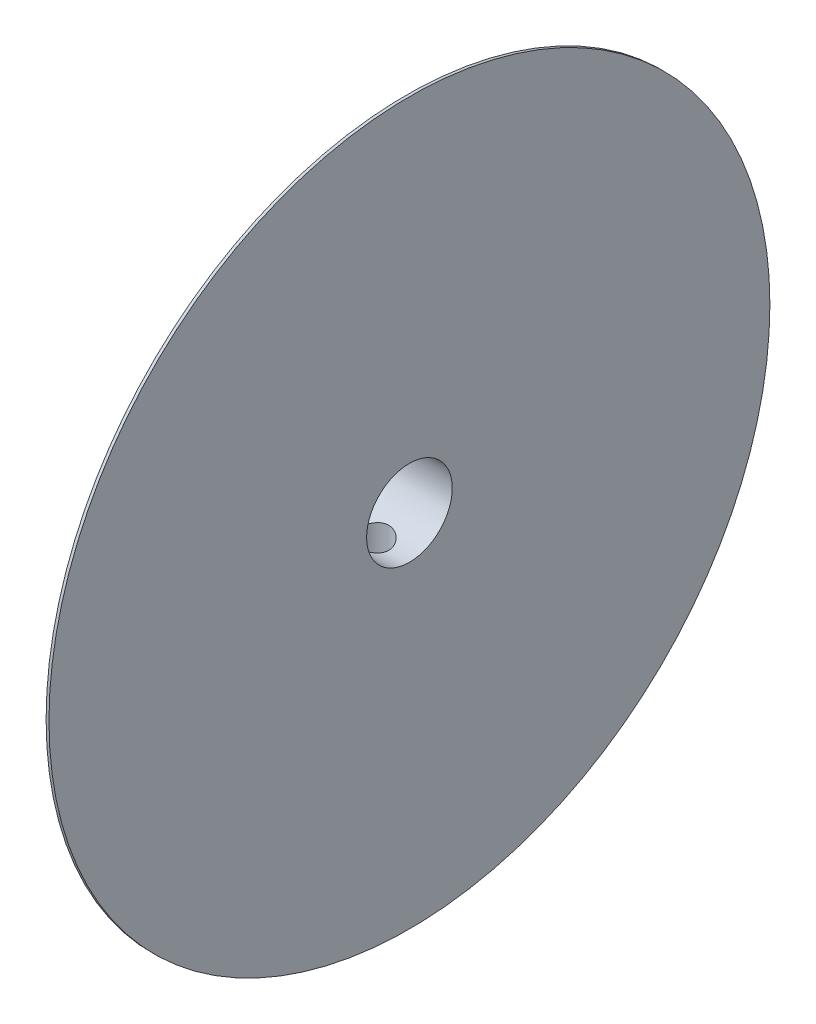
ISO-10303-21;
HEADER;
FILE_DESCRIPTION(('STEP AP214'),'2;1');
FILE_NAME('part.step','',(''),(''),'','','');
FILE_SCHEMA(('AUTOMOTIVE_DESIGN { 1 0 10303 214 1 1 1 1 }'));
ENDSEC;
DATA;
#1=APPLICATION_CONTEXT('core data for automotive mechanical design processes');
#2=APPLICATION_PROTOCOL_DEFINITION('international standard','automotive_design',2000,#1);
#3=PRODUCT_CONTEXT('',#1,'mechanical');
#4=PRODUCT('Part','Part','',(#3));
#5=PRODUCT_RELATED_PRODUCT_CATEGORY('part','',(#4));
#6=PRODUCT_DEFINITION_FORMATION('','',#4);
#7=PRODUCT_DEFINITION_CONTEXT('part definition',#1,'design');
#8=PRODUCT_DEFINITION('design','',#6,#7);
#9=PRODUCT_DEFINITION_SHAPE('','',#8);
#10=(LENGTH_UNIT() NAMED_UNIT(*) SI_UNIT(.MILLI.,.METRE.));
#11=(NAMED_UNIT(*) PLANE_ANGLE_UNIT() SI_UNIT($,.RADIAN.));
#12=(NAMED_UNIT(*) SI_UNIT($,.STERADIAN.) SOLID_ANGLE_UNIT());
#13=UNCERTAINTY_MEASURE_WITH_UNIT(LENGTH_MEASURE(1.E-05),#10,'distance_accuracy_value','');
#14=(GEOMETRIC_REPRESENTATION_CONTEXT(3) GLOBAL_UNCERTAINTY_ASSIGNED_CONTEXT((#13)) GLOBAL_UNIT_ASSIGNED_CONTEXT((#10,
#11,#12)) REPRESENTATION_CONTEXT('',''));
#15=CARTESIAN_POINT('',(0.,0.,0.));
#16=DIRECTION('',(0.,0.,1.));
#17=DIRECTION('',(1.,0.,0.));
#18=AXIS2_PLACEMENT_3D('',#15,#16,#17);
#19=CARTESIAN_POINT('',(-5.,0.,0.));
#20=DIRECTION('',(1.,0.,0.));
#21=DIRECTION('',(0.,0.,-1.));
#22=AXIS2_PLACEMENT_3D('',#19,#20,#21);
#23=CYLINDRICAL_SURFACE('',#22,7.25);
#24=CARTESIAN_POINT('',(-2.5,-7.14142842854285,1.25));
#25=CARTESIAN_POINT('',(-2.56965087488858,-7.14142971421709,1.24999723218608));
#26=CARTESIAN_POINT('',(-2.6393388962842,-7.14245844346318,1.24415878187445));
#27=CARTESIAN_POINT('',(-2.77675705222951,-7.14645809578312,1.22097086458515));
#28=CARTESIAN_POINT('',(-2.84448536188926,-7.14943077190657,1.20361100740192));
#29=CARTESIAN_POINT('',(-2.97597557878876,-7.15697185613425,1.15792320798728));
#30=CARTESIAN_POINT('',(-3.03974084640805,-7.16153888997427,1.12960470933528));
#31=CARTESIAN_POINT('',(-3.16160895574196,-7.17175247485429,1.06282742249073));
#32=CARTESIAN_POINT('',(-3.21971238180596,-7.17739891431205,1.02436968227406));
#33=CARTESIAN_POINT('',(-3.32922613195372,-7.18920159394736,0.937973280437725));
#34=CARTESIAN_POINT('',(-3.38056811585885,-7.19536214240758,0.889948569077897));
#35=CARTESIAN_POINT('',(-3.4745074937364,-7.20746068922563,0.785967443951569));
#36=CARTESIAN_POINT('',(-3.51710435507917,-7.21339867401004,0.730010547418791));
#37=CARTESIAN_POINT('',(-3.5926022771987,-7.2244287925949,0.611308996292318));
#38=CARTESIAN_POINT('',(-3.62543950854127,-7.22951526688981,0.548523173341608));
#39=CARTESIAN_POINT('',(-3.68007551886598,-7.23822123690654,0.418224186896049));
#40=CARTESIAN_POINT('',(-3.70187506550793,-7.24184083464466,0.350711352531921));
#41=CARTESIAN_POINT('',(-3.7336072496867,-7.24717480217743,0.213581461092618));
#42=CARTESIAN_POINT('',(-3.74365482340877,-7.2489076132889,0.143991729585504));
#43=CARTESIAN_POINT('',(-3.75195544180747,-7.2503361806486,0.00409407070862154));
#44=CARTESIAN_POINT('',(-3.75020934185093,-7.25003208462881,-0.0662138042066329));
#45=CARTESIAN_POINT('',(-3.73506141942176,-7.24743564978377,-0.20476549232864));
#46=CARTESIAN_POINT('',(-3.72178330700746,-7.24516441422403,-0.273023282991308));
#47=CARTESIAN_POINT('',(-3.68414330263072,-7.2389124583865,-0.406327251761107));
#48=CARTESIAN_POINT('',(-3.65978105482079,-7.2349316832255,-0.471373326684291));
#49=CARTESIAN_POINT('',(-3.60054273903589,-7.2256721655453,-0.596772947723074));
#50=CARTESIAN_POINT('',(-3.56561610006645,-7.22038720289371,-0.657102126264377));
#51=CARTESIAN_POINT('',(-3.48627754483205,-7.20910577268085,-0.771089902203244));
#52=CARTESIAN_POINT('',(-3.44186480845498,-7.20310924362167,-0.824747922216766));
#53=CARTESIAN_POINT('',(-3.34412978072987,-7.19097900207124,-0.924601707526047));
#54=CARTESIAN_POINT('',(-3.29069933330247,-7.18484451921934,-0.970691580728869));
#55=CARTESIAN_POINT('',(-3.17680889463413,-7.17320480520099,-1.05326978277058));
#56=CARTESIAN_POINT('',(-3.11634882942283,-7.16769958065723,-1.08975801056134));
#57=CARTESIAN_POINT('',(-2.98998795274555,-7.1579411060102,-1.15212042743271));
#58=CARTESIAN_POINT('',(-2.92408037544799,-7.15368944368538,-1.17798117178192));
#59=CARTESIAN_POINT('',(-2.78876672867699,-7.14694519270228,-1.21823438745853));
#60=CARTESIAN_POINT('',(-2.71936099097346,-7.14445243756213,-1.2326279441803));
#61=CARTESIAN_POINT('',(-2.57997061303613,-7.14154065319019,-1.24938764754429));
#62=CARTESIAN_POINT('',(-2.5100046876036,-7.14109554554239,-1.25190505695099));
#63=CARTESIAN_POINT('',(-2.3706515010969,-7.14225990611827,-1.24524472925199));
#64=CARTESIAN_POINT('',(-2.30126421615114,-7.14386928915848,-1.23606747703139));
#65=CARTESIAN_POINT('',(-2.16552287959039,-7.14893714768664,-1.20640754124708));
#66=CARTESIAN_POINT('',(-2.09915135559055,-7.15238292575729,-1.18600245936773));
#67=CARTESIAN_POINT('',(-1.97076970598821,-7.16072459277848,-1.13454772720554));
#68=CARTESIAN_POINT('',(-1.90875985793114,-7.16562057390631,-1.10349740027362));
#69=CARTESIAN_POINT('',(-1.79019038710856,-7.17637126932986,-1.03127893427043));
#70=CARTESIAN_POINT('',(-1.73369041009044,-7.18223494497608,-0.990014226162167));
#71=CARTESIAN_POINT('',(-1.62836244505018,-7.19423440082679,-0.898670276540918));
#72=CARTESIAN_POINT('',(-1.5795350365973,-7.20037020154216,-0.848590369752094));
#73=CARTESIAN_POINT('',(-1.49038251598762,-7.21230539665784,-0.740365997921969));
#74=CARTESIAN_POINT('',(-1.45015850860188,-7.21810026577049,-0.682137669786819));
#75=CARTESIAN_POINT('',(-1.38006419912053,-7.22862716641665,-0.559662033046176));
#76=CARTESIAN_POINT('',(-1.35019354430749,-7.23335923415568,-0.495414929582723));
#77=CARTESIAN_POINT('',(-1.30180961885663,-7.24120774262404,-0.363020254393968));
#78=CARTESIAN_POINT('',(-1.28324430675976,-7.24433157603979,-0.294892158495961));
#79=CARTESIAN_POINT('',(-1.25783085755296,-7.24864297538833,-0.156426634167659));
#80=CARTESIAN_POINT('',(-1.25098168566781,-7.24983071231766,-0.0860894014082541));
#81=CARTESIAN_POINT('',(-1.24922637569705,-7.25013341590993,0.0538236190178097));
#82=CARTESIAN_POINT('',(-1.25416670972454,-7.24927502822976,0.12339747038685));
#83=CARTESIAN_POINT('',(-1.27551699475709,-7.24563658240393,0.260708504701283));
#84=CARTESIAN_POINT('',(-1.29192687025291,-7.24285653690943,0.328445699735172));
#85=CARTESIAN_POINT('',(-1.33568993685657,-7.23568627667127,0.460095987386091));
#86=CARTESIAN_POINT('',(-1.36302919576524,-7.23129811246316,0.524013829926682));
#87=CARTESIAN_POINT('',(-1.42785755243027,-7.2213895739629,0.64637868576379));
#88=CARTESIAN_POINT('',(-1.46534718535402,-7.21586913997677,0.704825410382866));
#89=CARTESIAN_POINT('',(-1.54995222729674,-7.20422227015533,0.8153602012511));
#90=CARTESIAN_POINT('',(-1.59717968019279,-7.19808925251501,0.867361823384343));
#91=CARTESIAN_POINT('',(-1.6996851896951,-7.18595292186522,0.962755858263156));
#92=CARTESIAN_POINT('',(-1.75496512997298,-7.17994963958234,1.00614625100788));
#93=CARTESIAN_POINT('',(-1.87250865555793,-7.1687028430237,1.08339247637685));
#94=CARTESIAN_POINT('',(-1.9348223249925,-7.16346547764741,1.11717300578367));
#95=CARTESIAN_POINT('',(-2.06430619208286,-7.15441647935852,1.17373430129081));
#96=CARTESIAN_POINT('',(-2.13147153294016,-7.15060344358231,1.19652589718002));
#97=CARTESIAN_POINT('',(-2.2490687245248,-7.14566721735659,1.22559588019671));
#98=CARTESIAN_POINT('',(-2.29879437345873,-7.1440866662801,1.23473248261273));
#99=CARTESIAN_POINT('',(-2.39900684777768,-7.14196681631464,1.24693548432377));
#100=CARTESIAN_POINT('',(-2.44949365766507,-7.14142749625445,1.25000200704094));
#101=CARTESIAN_POINT('',(-2.5,-7.14142842854285,1.25));
#102=B_SPLINE_CURVE_WITH_KNOTS('',3,(#24,#25,#26,#27,#28,#29,#30,#31,#32,#33,#34,#35,#36,#37,
#38,#39,#40,#41,#42,#43,#44,#45,#46,#47,#48,#49,#50,#51,#52,#53,#54,#55,#56,#57,#58,#59,#60,#61,
#62,#63,#64,#65,#66,#67,#68,#69,#70,#71,#72,#73,#74,#75,#76,#77,#78,#79,#80,#81,#82,#83,#84,#85,
#86,#87,#88,#89,#90,#91,#92,#93,#94,#95,#96,#97,#98,#99,#100,#101),.UNSPECIFIED.,.T.,.F.,(4,2,2,
2,2,2,2,2,2,2,2,2,2,2,2,2,2,2,2,2,2,2,2,2,2,2,2,2,2,2,2,2,2,2,2,2,2,2,4),(0.,0.208767897361638,
0.417724321542029,0.626501077645268,0.835256263368652,1.04598154842973,1.25671966410077,
1.46880715279201,1.68087988898579,1.89086070156808,2.10082628490985,2.30856689374179,
2.51631417239412,2.72507209850941,2.93384807991603,3.14533377792209,3.35682170152396,
3.56857635896328,3.78031097097978,3.9893413699604,4.19836310238601,4.4059579939034,
4.61356608332654,4.82321739082735,5.03288452733008,5.24489456323004,5.45689737567405,
5.66791675720179,5.87891750043241,6.08718552897792,6.29545218641291,6.50345419881241,
6.71146718002738,6.92202244194999,7.13262703717487,7.34483913347008,7.55684166131537,
7.70822981412779,7.85961488875257),.UNSPECIFIED.);
#103=CARTESIAN_POINT('',(-2.5,-7.14142842854285,1.25));
#104=VERTEX_POINT('',#103);
#105=EDGE_CURVE('E56',#104,#104,#102,.T.);
#106=ORIENTED_EDGE('',*,*,#105,.F.);
#107=EDGE_LOOP('',(#106));
#108=FACE_BOUND('',#107,.T.);
#109=CARTESIAN_POINT('',(-5.,0.,0.));
#110=DIRECTION('',(-1.,0.,0.));
#111=DIRECTION('',(0.,0.,1.));
#112=AXIS2_PLACEMENT_3D('',#109,#110,#111);
#113=CIRCLE('',#112,7.25);
#114=CARTESIAN_POINT('',(-5.,0.,7.25));
#115=VERTEX_POINT('',#114);
#116=EDGE_CURVE('E46',#115,#115,#113,.T.);
#117=ORIENTED_EDGE('',*,*,#116,.F.);
#118=EDGE_LOOP('',(#117));
#119=FACE_BOUND('',#118,.T.);
#120=CARTESIAN_POINT('',(0.,0.,0.));
#121=DIRECTION('',(-1.,0.,0.));
#122=DIRECTION('',(0.,0.,1.));
#123=AXIS2_PLACEMENT_3D('',#120,#121,#122);
#124=CIRCLE('',#123,7.25);
#125=CARTESIAN_POINT('',(0.,0.,7.25));
#126=VERTEX_POINT('',#125);
#127=EDGE_CURVE('E10',#126,#126,#124,.T.);
#128=ORIENTED_EDGE('',*,*,#127,.T.);
#129=EDGE_LOOP('',(#128));
#130=FACE_BOUND('',#129,.T.);
#131=CARTESIAN_POINT('',(-2.5,7.14142842854285,-1.25));
#132=CARTESIAN_POINT('',(-2.43034912511142,7.14142971421709,-1.24999723218608));
#133=CARTESIAN_POINT('',(-2.3606611037158,7.14245844346318,-1.24415878187445));
#134=CARTESIAN_POINT('',(-2.22324294777049,7.14645809578312,-1.22097086458515));
#135=CARTESIAN_POINT('',(-2.15551463811074,7.14943077190657,-1.20361100740192));
#136=CARTESIAN_POINT('',(-2.02402442121124,7.15697185613425,-1.15792320798728));
#137=CARTESIAN_POINT('',(-1.96025915359195,7.16153888997427,-1.12960470933528));
#138=CARTESIAN_POINT('',(-1.83839104425804,7.17175247485429,-1.06282742249073));
#139=CARTESIAN_POINT('',(-1.78028761819404,7.17739891431205,-1.02436968227406));
#140=CARTESIAN_POINT('',(-1.67077386804628,7.18920159394736,-0.937973280437725));
#141=CARTESIAN_POINT('',(-1.61943188414115,7.19536214240758,-0.889948569077896));
#142=CARTESIAN_POINT('',(-1.5254925062636,7.20746068922563,-0.785967443951568));
#143=CARTESIAN_POINT('',(-1.48289564492083,7.21339867401004,-0.730010547418791));
#144=CARTESIAN_POINT('',(-1.4073977228013,7.2244287925949,-0.611308996292318));
#145=CARTESIAN_POINT('',(-1.37456049145873,7.22951526688981,-0.548523173341608));
#146=CARTESIAN_POINT('',(-1.31992448113402,7.23822123690654,-0.41822418689605));
#147=CARTESIAN_POINT('',(-1.29812493449207,7.24184083464466,-0.350711352531921));
#148=CARTESIAN_POINT('',(-1.2663927503133,7.24717480217743,-0.213581461092618));
#149=CARTESIAN_POINT('',(-1.25634517659123,7.2489076132889,-0.143991729585504));
#150=CARTESIAN_POINT('',(-1.24804455819253,7.2503361806486,-0.00409407070862197));
#151=CARTESIAN_POINT('',(-1.24979065814907,7.25003208462881,0.0662138042066324));
#152=CARTESIAN_POINT('',(-1.26493858057824,7.24743564978377,0.20476549232864));
#153=CARTESIAN_POINT('',(-1.27821669299254,7.24516441422403,0.273023282991308));
#154=CARTESIAN_POINT('',(-1.31585669736928,7.2389124583865,0.406327251761106));
#155=CARTESIAN_POINT('',(-1.34021894517921,7.2349316832255,0.47137332668429));
#156=CARTESIAN_POINT('',(-1.39945726096411,7.2256721655453,0.596772947723074));
#157=CARTESIAN_POINT('',(-1.43438389993355,7.22038720289371,0.657102126264377));
#158=CARTESIAN_POINT('',(-1.51372245516795,7.20910577268085,0.771089902203243));
#159=CARTESIAN_POINT('',(-1.55813519154502,7.20310924362167,0.824747922216766));
#160=CARTESIAN_POINT('',(-1.65587021927013,7.19097900207124,0.924601707526047));
#161=CARTESIAN_POINT('',(-1.70930066669753,7.18484451921934,0.970691580728869));
#162=CARTESIAN_POINT('',(-1.82319110536587,7.17320480520099,1.05326978277058));
#163=CARTESIAN_POINT('',(-1.88365117057717,7.16769958065723,1.08975801056134));
#164=CARTESIAN_POINT('',(-2.01001204725445,7.1579411060102,1.15212042743271));
#165=CARTESIAN_POINT('',(-2.07591962455201,7.15368944368539,1.17798117178192));
#166=CARTESIAN_POINT('',(-2.21123327132301,7.14694519270228,1.21823438745853));
#167=CARTESIAN_POINT('',(-2.28063900902654,7.14445243756213,1.2326279441803));
#168=CARTESIAN_POINT('',(-2.42002938696387,7.14154065319019,1.24938764754429));
#169=CARTESIAN_POINT('',(-2.4899953123964,7.14109554554239,1.25190505695099));
#170=CARTESIAN_POINT('',(-2.6293484989031,7.14225990611827,1.24524472925199));
#171=CARTESIAN_POINT('',(-2.69873578384885,7.14386928915848,1.23606747703139));
#172=CARTESIAN_POINT('',(-2.83447712040961,7.14893714768664,1.20640754124708));
#173=CARTESIAN_POINT('',(-2.90084864440945,7.15238292575729,1.18600245936773));
#174=CARTESIAN_POINT('',(-3.0292302940118,7.16072459277848,1.13454772720554));
#175=CARTESIAN_POINT('',(-3.09124014206886,7.16562057390631,1.10349740027362));
#176=CARTESIAN_POINT('',(-3.20980961289144,7.17637126932986,1.03127893427043));
#177=CARTESIAN_POINT('',(-3.26630958990956,7.18223494497608,0.990014226162167));
#178=CARTESIAN_POINT('',(-3.37163755494982,7.19423440082679,0.898670276540918));
#179=CARTESIAN_POINT('',(-3.4204649634027,7.20037020154216,0.848590369752094));
#180=CARTESIAN_POINT('',(-3.50961748401238,7.21230539665785,0.740365997921969));
#181=CARTESIAN_POINT('',(-3.54984149139812,7.21810026577049,0.682137669786819));
#182=CARTESIAN_POINT('',(-3.61993580087947,7.22862716641665,0.559662033046177));
#183=CARTESIAN_POINT('',(-3.64980645569251,7.23335923415568,0.495414929582723));
#184=CARTESIAN_POINT('',(-3.69819038114337,7.24120774262404,0.363020254393968));
#185=CARTESIAN_POINT('',(-3.71675569324024,7.24433157603979,0.294892158495962));
#186=CARTESIAN_POINT('',(-3.74216914244704,7.24864297538833,0.156426634167659));
#187=CARTESIAN_POINT('',(-3.74901831433219,7.24983071231766,0.0860894014082546));
#188=CARTESIAN_POINT('',(-3.75077362430295,7.25013341590993,-0.0538236190178089));
#189=CARTESIAN_POINT('',(-3.74583329027546,7.24927502822976,-0.123397470386849));
#190=CARTESIAN_POINT('',(-3.72448300524291,7.24563658240393,-0.260708504701282));
#191=CARTESIAN_POINT('',(-3.70807312974709,7.24285653690943,-0.328445699735172));
#192=CARTESIAN_POINT('',(-3.66431006314343,7.23568627667127,-0.46009598738609));
#193=CARTESIAN_POINT('',(-3.63697080423476,7.23129811246316,-0.524013829926681));
#194=CARTESIAN_POINT('',(-3.57214244756973,7.2213895739629,-0.646378685763789));
#195=CARTESIAN_POINT('',(-3.53465281464598,7.21586913997677,-0.704825410382865));
#196=CARTESIAN_POINT('',(-3.45004777270326,7.20422227015533,-0.8153602012511));
#197=CARTESIAN_POINT('',(-3.40282031980721,7.19808925251501,-0.867361823384342));
#198=CARTESIAN_POINT('',(-3.3003148103049,7.18595292186522,-0.962755858263155));
#199=CARTESIAN_POINT('',(-3.24503487002703,7.17994963958234,-1.00614625100788));
#200=CARTESIAN_POINT('',(-3.12749134444207,7.1687028430237,-1.08339247637685));
#201=CARTESIAN_POINT('',(-3.0651776750075,7.16346547764741,-1.11717300578367));
#202=CARTESIAN_POINT('',(-2.93569380791714,7.15441647935852,-1.17373430129081));
#203=CARTESIAN_POINT('',(-2.86852846705984,7.1506034435823,-1.19652589718002));
#204=CARTESIAN_POINT('',(-2.7509312754752,7.14566721735659,-1.22559588019671));
#205=CARTESIAN_POINT('',(-2.70120562654127,7.1440866662801,-1.23473248261273));
#206=CARTESIAN_POINT('',(-2.60099315222232,7.14196681631464,-1.24693548432377));
#207=CARTESIAN_POINT('',(-2.55050634233493,7.14142749625445,-1.25000200704094));
#208=CARTESIAN_POINT('',(-2.5,7.14142842854285,-1.25));
#209=B_SPLINE_CURVE_WITH_KNOTS('',3,(#131,#132,#133,#134,#135,#136,#137,#138,#139,#140,#141,
#142,#143,#144,#145,#146,#147,#148,#149,#150,#151,#152,#153,#154,#155,#156,#157,#158,#159,#160,
#161,#162,#163,#164,#165,#166,#167,#168,#169,#170,#171,#172,#173,#174,#175,#176,#177,#178,#179,
#180,#181,#182,#183,#184,#185,#186,#187,#188,#189,#190,#191,#192,#193,#194,#195,#196,#197,#198,
#199,#200,#201,#202,#203,#204,#205,#206,#207,#208),.UNSPECIFIED.,.T.,.F.,(4,2,2,2,2,2,2,2,2,2,2,
2,2,2,2,2,2,2,2,2,2,2,2,2,2,2,2,2,2,2,2,2,2,2,2,2,2,2,4),(0.,0.208767897361638,
0.417724321542029,0.626501077645268,0.835256263368652,1.04598154842973,1.25671966410077,
1.46880715279201,1.68087988898579,1.89086070156808,2.10082628490985,2.30856689374179,
2.51631417239412,2.72507209850941,2.93384807991603,3.14533377792209,3.35682170152396,
3.56857635896328,3.78031097097978,3.9893413699604,4.19836310238601,4.4059579939034,
4.61356608332654,4.82321739082735,5.03288452733008,5.24489456323004,5.45689737567405,
5.66791675720179,5.87891750043241,6.08718552897792,6.29545218641291,6.50345419881241,
6.71146718002738,6.92202244194998,7.13262703717487,7.34483913347008,7.55684166131537,
7.70822981412779,7.85961488875258),.UNSPECIFIED.);
#210=CARTESIAN_POINT('',(-2.5,7.14142842854285,-1.25));
#211=VERTEX_POINT('',#210);
#212=EDGE_CURVE('E53',#211,#211,#209,.T.);
#213=ORIENTED_EDGE('',*,*,#212,.T.);
#214=EDGE_LOOP('',(#213));
#215=FACE_BOUND('',#214,.T.);
#216=ADVANCED_FACE('F32',(#108,#119,#130,#215),#23,.T.);
#217=CARTESIAN_POINT('',(0.201,0.,0.));
#218=DIRECTION('',(-1.,0.,0.));
#219=DIRECTION('',(0.,0.,1.));
#220=AXIS2_PLACEMENT_3D('',#217,#218,#219);
#221=CYLINDRICAL_SURFACE('',#220,3.);
#222=CARTESIAN_POINT('',(-2.5,-2.72717802865893,1.25));
#223=CARTESIAN_POINT('',(-2.43332810910315,-2.72718519563219,1.24999259066568));
#224=CARTESIAN_POINT('',(-2.36654734317378,-2.729658595344,1.24463203881503));
#225=CARTESIAN_POINT('',(-2.23491305794286,-2.73923833650884,1.22339678947785));
#226=CARTESIAN_POINT('',(-2.17006527332476,-2.74635725824267,1.20749354003276));
#227=CARTESIAN_POINT('',(-2.04443887030893,-2.76426917574768,1.16589988419451));
#228=CARTESIAN_POINT('',(-1.98364483628498,-2.77504717562616,1.14024937431428));
#229=CARTESIAN_POINT('',(-1.86724055042195,-2.79904148565793,1.08000637754463));
#230=CARTESIAN_POINT('',(-1.81162907656688,-2.81225721880783,1.04541600591531));
#231=CARTESIAN_POINT('',(-1.70367427502653,-2.84055762619857,0.965973882676166));
#232=CARTESIAN_POINT('',(-1.65169244125591,-2.85570568079146,0.920653238184409));
#233=CARTESIAN_POINT('',(-1.55579977750244,-2.88564295372227,0.82202167574555));
#234=CARTESIAN_POINT('',(-1.51189205938699,-2.90043203180789,0.768707691374005));
#235=CARTESIAN_POINT('',(-1.43155046912072,-2.92875537930613,0.652763393797349));
#236=CARTESIAN_POINT('',(-1.39552337196765,-2.94220739975291,0.589829293683659));
#237=CARTESIAN_POINT('',(-1.33472397949439,-2.96556519993426,0.458132022362353));
#238=CARTESIAN_POINT('',(-1.30994668803578,-2.97547255347157,0.389371454872124));
#239=CARTESIAN_POINT('',(-1.27366054124326,-2.99017521042367,0.251768498025166));
#240=CARTESIAN_POINT('',(-1.26152830509795,-2.99520971127466,0.183116576196081));
#241=CARTESIAN_POINT('',(-1.24886235884014,-3.00046828611204,0.0445791803650063));
#242=CARTESIAN_POINT('',(-1.24832394411704,-3.00069431131015,-0.0253057817645161));
#243=CARTESIAN_POINT('',(-1.25853428093332,-2.99645129133057,-0.159792780112568));
#244=CARTESIAN_POINT('',(-1.26859810052573,-2.99226714648664,-0.224457488607313));
#245=CARTESIAN_POINT('',(-1.29855310263816,-2.98006516750309,-0.351082893931456));
#246=CARTESIAN_POINT('',(-1.31844500963016,-2.97204705074577,-0.413043391054916));
#247=CARTESIAN_POINT('',(-1.36772804089464,-2.95279852414029,-0.533638118077525));
#248=CARTESIAN_POINT('',(-1.39725946287082,-2.94152097126085,-0.592207177074906));
#249=CARTESIAN_POINT('',(-1.46484575670034,-2.91685713989805,-0.703711767281964));
#250=CARTESIAN_POINT('',(-1.50290364084498,-2.90347011666255,-0.756645297756974));
#251=CARTESIAN_POINT('',(-1.58958242040462,-2.87481698777061,-0.859340911707924));
#252=CARTESIAN_POINT('',(-1.63875879127901,-2.8594849435601,-0.90861643731624));
#253=CARTESIAN_POINT('',(-1.74471144070658,-2.8293786068147,-0.998431414927668));
#254=CARTESIAN_POINT('',(-1.80149063829209,-2.8146045313137,-1.03896749582431));
#255=CARTESIAN_POINT('',(-1.92339503666191,-2.78681612355338,-1.11140189250063));
#256=CARTESIAN_POINT('',(-1.98873320574328,-2.77387558556714,-1.1429725335554));
#257=CARTESIAN_POINT('',(-2.1244810449745,-2.75209844221011,-1.19446432058392));
#258=CARTESIAN_POINT('',(-2.19488704826954,-2.74325890334594,-1.21439379627313));
#259=CARTESIAN_POINT('',(-2.333896808914,-2.73141212519724,-1.24080025168121));
#260=CARTESIAN_POINT('',(-2.40232112225905,-2.72806369197117,-1.24806614632866));
#261=CARTESIAN_POINT('',(-2.5394784824115,-2.72660286810642,-1.25125630518999));
#262=CARTESIAN_POINT('',(-2.60821141419171,-2.72848866599319,-1.24718449318149));
#263=CARTESIAN_POINT('',(-2.73939838543045,-2.73693131345749,-1.22853477565556));
#264=CARTESIAN_POINT('',(-2.8019726867868,-2.74318138016618,-1.21464618818048));
#265=CARTESIAN_POINT('',(-2.92385129649787,-2.75925630297447,-1.17767058564225));
#266=CARTESIAN_POINT('',(-2.98315483683071,-2.76908199460161,-1.15458142053125));
#267=CARTESIAN_POINT('',(-3.09961531035647,-2.79170797857,-1.09877520805187));
#268=CARTESIAN_POINT('',(-3.15657497461032,-2.80461662202282,-1.06569183306198));
#269=CARTESIAN_POINT('',(-3.26440805249902,-2.83180003740794,-0.991200784385971));
#270=CARTESIAN_POINT('',(-3.31527881670187,-2.84607539920583,-0.949789507875988));
#271=CARTESIAN_POINT('',(-3.41380013488401,-2.87578619784532,-0.855844455715506));
#272=CARTESIAN_POINT('',(-3.46085139995066,-2.89122146708842,-0.802679661479739));
#273=CARTESIAN_POINT('',(-3.54547229197933,-2.92043361183923,-0.68885151255354));
#274=CARTESIAN_POINT('',(-3.5830412240637,-2.93421036577013,-0.628187608803657));
#275=CARTESIAN_POINT('',(-3.64758987544358,-2.9586425158565,-0.500654680803385));
#276=CARTESIAN_POINT('',(-3.67454224128948,-2.96928983138826,-0.433770169638507));
#277=CARTESIAN_POINT('',(-3.71661679233443,-2.98618173103366,-0.295858835154417));
#278=CARTESIAN_POINT('',(-3.73174601822607,-2.9924289351992,-0.224834504225196));
#279=CARTESIAN_POINT('',(-3.74885812552031,-2.9995153479751,-0.0860165335064117));
#280=CARTESIAN_POINT('',(-3.75168599969696,-3.00070204534225,-0.0183440847938983));
#281=CARTESIAN_POINT('',(-3.74638685870606,-2.99849523480953,0.116486811714285));
#282=CARTESIAN_POINT('',(-3.73826176398713,-2.99510252984313,0.183645347541155));
#283=CARTESIAN_POINT('',(-3.71189392784134,-2.98430065981734,0.313086482449184));
#284=CARTESIAN_POINT('',(-3.69402031953045,-2.97703824209233,0.375457537843569));
#285=CARTESIAN_POINT('',(-3.64906575279087,-2.95929499847058,0.49629223050133));
#286=CARTESIAN_POINT('',(-3.6219830453351,-2.94881356124207,0.554755122985827));
#287=CARTESIAN_POINT('',(-3.55801047078554,-2.92505825398662,0.669024565478781));
#288=CARTESIAN_POINT('',(-3.52073269857601,-2.91167959188766,0.724591657976682));
#289=CARTESIAN_POINT('',(-3.43799281712811,-2.88371561874231,0.828918675638782));
#290=CARTESIAN_POINT('',(-3.39252766959325,-2.86912986083797,0.877676061786042));
#291=CARTESIAN_POINT('',(-3.2910551741456,-2.83914845259141,0.97044978723158));
#292=CARTESIAN_POINT('',(-3.23454098537888,-2.82376522857896,1.01391775364847));
#293=CARTESIAN_POINT('',(-3.11454125931981,-2.79495552690186,1.09083332306674));
#294=CARTESIAN_POINT('',(-3.05105185194186,-2.78153014522558,1.12427532456755));
#295=CARTESIAN_POINT('',(-2.91905616497725,-2.75842557732642,1.17982766043577));
#296=CARTESIAN_POINT('',(-2.85057884120679,-2.74872654469865,1.20199823632854));
#297=CARTESIAN_POINT('',(-2.71046042614933,-2.73440803066667,1.23423556453801));
#298=CARTESIAN_POINT('',(-2.6388307927257,-2.72977151604981,1.2443429152121));
#299=CARTESIAN_POINT('',(-2.54464147573811,-2.72744979732688,1.2494046492365));
#300=CARTESIAN_POINT('',(-2.52232684261197,-2.72717562860874,1.25000248121118));
#301=CARTESIAN_POINT('',(-2.5,-2.72717802865893,1.25));
#302=B_SPLINE_CURVE_WITH_KNOTS('',3,(#222,#223,#224,#225,#226,#227,#228,#229,#230,#231,#232,
#233,#234,#235,#236,#237,#238,#239,#240,#241,#242,#243,#244,#245,#246,#247,#248,#249,#250,#251,
#252,#253,#254,#255,#256,#257,#258,#259,#260,#261,#262,#263,#264,#265,#266,#267,#268,#269,#270,
#271,#272,#273,#274,#275,#276,#277,#278,#279,#280,#281,#282,#283,#284,#285,#286,#287,#288,#289,
#290,#291,#292,#293,#294,#295,#296,#297,#298,#299,#300,#301),.UNSPECIFIED.,.T.,.F.,(4,2,2,2,2,2,
2,2,2,2,2,2,2,2,2,2,2,2,2,2,2,2,2,2,2,2,2,2,2,2,2,2,2,2,2,2,2,2,2,4),(0.,0.199951711985515,
0.400447161842176,0.600130652152112,0.799766938550101,1.01066841430654,1.22165100459911,
1.44178476577924,1.66182066774891,1.87040605977952,2.0789068091793,2.27471840245093,
2.47054443201884,2.66935814640066,2.86824221022484,3.08114531844484,3.29413040441367,
3.51411545666722,3.73394290745569,3.93950778306308,4.14500152518449,4.33733901066192,
4.5297214691353,4.73025126818169,4.93086800795466,5.14781662735514,5.36478114041866,
5.58230105955595,5.79969134643008,6.00188635094054,6.20404590801915,6.39903415036488,
6.59405944632173,6.79789862829037,7.00181361048905,7.21960426908078,7.43751638139189,
7.65425125796865,7.87025464546163,7.93721375436706),.UNSPECIFIED.);
#303=CARTESIAN_POINT('',(-2.5,-2.72717802865893,1.25));
#304=VERTEX_POINT('',#303);
#305=EDGE_CURVE('E65',#304,#304,#302,.T.);
#306=ORIENTED_EDGE('',*,*,#305,.F.);
#307=EDGE_LOOP('',(#306));
#308=FACE_BOUND('',#307,.T.);
#309=CARTESIAN_POINT('',(0.2,0.,0.));
#310=DIRECTION('',(1.,0.,0.));
#311=DIRECTION('',(0.,0.,-1.));
#312=AXIS2_PLACEMENT_3D('',#309,#310,#311);
#313=CIRCLE('',#312,3.);
#314=CARTESIAN_POINT('',(0.2,0.,-3.));
#315=VERTEX_POINT('',#314);
#316=EDGE_CURVE('E50',#315,#315,#313,.F.);
#317=ORIENTED_EDGE('',*,*,#316,.F.);
#318=EDGE_LOOP('',(#317));
#319=FACE_BOUND('',#318,.T.);
#320=CARTESIAN_POINT('',(-5.,0.,0.));
#321=DIRECTION('',(-1.,0.,0.));
#322=DIRECTION('',(0.,0.,1.));
#323=AXIS2_PLACEMENT_3D('',#320,#321,#322);
#324=CIRCLE('',#323,3.);
#325=CARTESIAN_POINT('',(-5.,0.,3.));
#326=VERTEX_POINT('',#325);
#327=EDGE_CURVE('E49',#326,#326,#324,.T.);
#328=ORIENTED_EDGE('',*,*,#327,.T.);
#329=EDGE_LOOP('',(#328));
#330=FACE_BOUND('',#329,.T.);
#331=CARTESIAN_POINT('',(-2.5,2.72717802865893,-1.25));
#332=CARTESIAN_POINT('',(-2.56667189089685,2.72718519563219,-1.24999259066568));
#333=CARTESIAN_POINT('',(-2.63345265682622,2.729658595344,-1.24463203881503));
#334=CARTESIAN_POINT('',(-2.76508694205714,2.73923833650884,-1.22339678947785));
#335=CARTESIAN_POINT('',(-2.82993472667524,2.74635725824267,-1.20749354003276));
#336=CARTESIAN_POINT('',(-2.95556112969107,2.76426917574768,-1.16589988419451));
#337=CARTESIAN_POINT('',(-3.01635516371502,2.77504717562616,-1.14024937431428));
#338=CARTESIAN_POINT('',(-3.13275944957805,2.79904148565793,-1.08000637754463));
#339=CARTESIAN_POINT('',(-3.18837092343312,2.81225721880783,-1.04541600591531));
#340=CARTESIAN_POINT('',(-3.29632572497347,2.84055762619857,-0.965973882676166));
#341=CARTESIAN_POINT('',(-3.34830755874409,2.85570568079146,-0.920653238184409));
#342=CARTESIAN_POINT('',(-3.44420022249756,2.88564295372227,-0.82202167574555));
#343=CARTESIAN_POINT('',(-3.48810794061301,2.90043203180789,-0.768707691374005));
#344=CARTESIAN_POINT('',(-3.56844953087928,2.92875537930613,-0.652763393797348));
#345=CARTESIAN_POINT('',(-3.60447662803235,2.94220739975291,-0.589829293683659));
#346=CARTESIAN_POINT('',(-3.66527602050561,2.96556519993426,-0.458132022362353));
#347=CARTESIAN_POINT('',(-3.69005331196422,2.97547255347157,-0.389371454872124));
#348=CARTESIAN_POINT('',(-3.72633945875674,2.99017521042367,-0.251768498025165));
#349=CARTESIAN_POINT('',(-3.73847169490205,2.99520971127466,-0.18311657619608));
#350=CARTESIAN_POINT('',(-3.75113764115986,3.00046828611204,-0.0445791803650061));
#351=CARTESIAN_POINT('',(-3.75167605588296,3.00069431131015,0.0253057817645164));
#352=CARTESIAN_POINT('',(-3.74146571906668,2.99645129133057,0.159792780112568));
#353=CARTESIAN_POINT('',(-3.73140189947427,2.99226714648664,0.224457488607314));
#354=CARTESIAN_POINT('',(-3.70144689736184,2.98006516750309,0.351082893931456));
#355=CARTESIAN_POINT('',(-3.68155499036984,2.97204705074577,0.413043391054916));
#356=CARTESIAN_POINT('',(-3.63227195910536,2.95279852414029,0.533638118077526));
#357=CARTESIAN_POINT('',(-3.60274053712918,2.94152097126085,0.592207177074907));
#358=CARTESIAN_POINT('',(-3.53515424329966,2.91685713989805,0.703711767281964));
#359=CARTESIAN_POINT('',(-3.49709635915502,2.90347011666255,0.756645297756975));
#360=CARTESIAN_POINT('',(-3.41041757959538,2.87481698777061,0.859340911707924));
#361=CARTESIAN_POINT('',(-3.36124120872099,2.8594849435601,0.90861643731624));
#362=CARTESIAN_POINT('',(-3.25528855929342,2.8293786068147,0.998431414927668));
#363=CARTESIAN_POINT('',(-3.19850936170791,2.8146045313137,1.03896749582431));
#364=CARTESIAN_POINT('',(-3.07660496333809,2.78681612355338,1.11140189250063));
#365=CARTESIAN_POINT('',(-3.01126679425672,2.77387558556714,1.1429725335554));
#366=CARTESIAN_POINT('',(-2.8755189550255,2.75209844221011,1.19446432058392));
#367=CARTESIAN_POINT('',(-2.80511295173046,2.74325890334594,1.21439379627313));
#368=CARTESIAN_POINT('',(-2.666103191086,2.73141212519724,1.24080025168121));
#369=CARTESIAN_POINT('',(-2.59767887774095,2.72806369197117,1.24806614632866));
#370=CARTESIAN_POINT('',(-2.4605215175885,2.72660286810642,1.25125630518999));
#371=CARTESIAN_POINT('',(-2.39178858580829,2.72848866599319,1.24718449318149));
#372=CARTESIAN_POINT('',(-2.26060161456955,2.73693131345749,1.22853477565556));
#373=CARTESIAN_POINT('',(-2.1980273132132,2.74318138016618,1.21464618818048));
#374=CARTESIAN_POINT('',(-2.07614870350213,2.75925630297447,1.17767058564225));
#375=CARTESIAN_POINT('',(-2.01684516316929,2.76908199460161,1.15458142053125));
#376=CARTESIAN_POINT('',(-1.90038468964353,2.79170797857,1.09877520805187));
#377=CARTESIAN_POINT('',(-1.84342502538968,2.80461662202282,1.06569183306198));
#378=CARTESIAN_POINT('',(-1.73559194750098,2.83180003740794,0.991200784385971));
#379=CARTESIAN_POINT('',(-1.68472118329813,2.84607539920583,0.949789507875988));
#380=CARTESIAN_POINT('',(-1.58619986511599,2.87578619784532,0.855844455715505));
#381=CARTESIAN_POINT('',(-1.53914860004934,2.89122146708842,0.802679661479739));
#382=CARTESIAN_POINT('',(-1.45452770802067,2.92043361183923,0.68885151255354));
#383=CARTESIAN_POINT('',(-1.4169587759363,2.93421036577013,0.628187608803657));
#384=CARTESIAN_POINT('',(-1.35241012455642,2.9586425158565,0.500654680803385));
#385=CARTESIAN_POINT('',(-1.32545775871052,2.96928983138826,0.433770169638507));
#386=CARTESIAN_POINT('',(-1.28338320766557,2.98618173103366,0.295858835154417));
#387=CARTESIAN_POINT('',(-1.26825398177393,2.9924289351992,0.224834504225196));
#388=CARTESIAN_POINT('',(-1.25114187447969,2.9995153479751,0.0860165335064118));
#389=CARTESIAN_POINT('',(-1.24831400030304,3.00070204534225,0.0183440847938984));
#390=CARTESIAN_POINT('',(-1.25361314129394,2.99849523480953,-0.116486811714285));
#391=CARTESIAN_POINT('',(-1.26173823601287,2.99510252984313,-0.183645347541154));
#392=CARTESIAN_POINT('',(-1.28810607215866,2.98430065981734,-0.313086482449184));
#393=CARTESIAN_POINT('',(-1.30597968046955,2.97703824209233,-0.375457537843568));
#394=CARTESIAN_POINT('',(-1.35093424720913,2.95929499847058,-0.49629223050133));
#395=CARTESIAN_POINT('',(-1.3780169546649,2.94881356124207,-0.554755122985826));
#396=CARTESIAN_POINT('',(-1.44198952921446,2.92505825398662,-0.669024565478781));
#397=CARTESIAN_POINT('',(-1.47926730142399,2.91167959188766,-0.724591657976681));
#398=CARTESIAN_POINT('',(-1.56200718287189,2.88371561874231,-0.828918675638781));
#399=CARTESIAN_POINT('',(-1.60747233040675,2.86912986083797,-0.877676061786042));
#400=CARTESIAN_POINT('',(-1.7089448258544,2.83914845259141,-0.97044978723158));
#401=CARTESIAN_POINT('',(-1.76545901462112,2.82376522857896,-1.01391775364847));
#402=CARTESIAN_POINT('',(-1.88545874068019,2.79495552690186,-1.09083332306674));
#403=CARTESIAN_POINT('',(-1.94894814805814,2.78153014522558,-1.12427532456755));
#404=CARTESIAN_POINT('',(-2.08094383502275,2.75842557732642,-1.17982766043577));
#405=CARTESIAN_POINT('',(-2.14942115879321,2.74872654469865,-1.20199823632854));
#406=CARTESIAN_POINT('',(-2.28953957385067,2.73440803066667,-1.23423556453801));
#407=CARTESIAN_POINT('',(-2.3611692072743,2.72977151604981,-1.2443429152121));
#408=CARTESIAN_POINT('',(-2.45535852426189,2.72744979732688,-1.2494046492365));
#409=CARTESIAN_POINT('',(-2.47767315738803,2.72717562860874,-1.25000248121118));
#410=CARTESIAN_POINT('',(-2.5,2.72717802865893,-1.25));
#411=B_SPLINE_CURVE_WITH_KNOTS('',3,(#331,#332,#333,#334,#335,#336,#337,#338,#339,#340,#341,
#342,#343,#344,#345,#346,#347,#348,#349,#350,#351,#352,#353,#354,#355,#356,#357,#358,#359,#360,
#361,#362,#363,#364,#365,#366,#367,#368,#369,#370,#371,#372,#373,#374,#375,#376,#377,#378,#379,
#380,#381,#382,#383,#384,#385,#386,#387,#388,#389,#390,#391,#392,#393,#394,#395,#396,#397,#398,
#399,#400,#401,#402,#403,#404,#405,#406,#407,#408,#409,#410),.UNSPECIFIED.,.T.,.F.,(4,2,2,2,2,2,
2,2,2,2,2,2,2,2,2,2,2,2,2,2,2,2,2,2,2,2,2,2,2,2,2,2,2,2,2,2,2,2,2,4),(0.,0.199951711985515,
0.400447161842176,0.600130652152112,0.7997669385501,1.01066841430654,1.22165100459911,
1.44178476577924,1.66182066774891,1.87040605977952,2.0789068091793,2.27471840245093,
2.47054443201884,2.66935814640066,2.86824221022484,3.08114531844484,3.29413040441367,
3.51411545666722,3.73394290745569,3.93950778306308,4.14500152518449,4.33733901066192,
4.5297214691353,4.73025126818169,4.93086800795466,5.14781662735514,5.36478114041866,
5.58230105955595,5.79969134643008,6.00188635094054,6.20404590801915,6.39903415036488,
6.59405944632173,6.79789862829037,7.00181361048905,7.21960426908078,7.43751638139189,
7.65425125796865,7.87025464546163,7.93721375436706),.UNSPECIFIED.);
#412=CARTESIAN_POINT('',(-2.5,2.72717802865893,-1.25));
#413=VERTEX_POINT('',#412);
#414=EDGE_CURVE('E64',#413,#413,#411,.T.);
#415=ORIENTED_EDGE('',*,*,#414,.T.);
#416=EDGE_LOOP('',(#415));
#417=FACE_BOUND('',#416,.T.);
#418=ADVANCED_FACE('F98',(#308,#319,#330,#417),#221,.F.);
#419=CARTESIAN_POINT('',(0.2,0.,0.));
#420=DIRECTION('',(-1.,0.,0.));
#421=DIRECTION('',(0.,0.,1.));
#422=AXIS2_PLACEMENT_3D('',#419,#420,#421);
#423=CYLINDRICAL_SURFACE('',#422,25.25);
#424=CARTESIAN_POINT('',(0.2,0.,0.));
#425=DIRECTION('',(1.,0.,0.));
#426=DIRECTION('',(0.,0.,-1.));
#427=AXIS2_PLACEMENT_3D('',#424,#425,#426);
#428=CIRCLE('',#427,25.25);
#429=CARTESIAN_POINT('',(0.2,0.,-25.25));
#430=VERTEX_POINT('',#429);
#431=EDGE_CURVE('E40',#430,#430,#428,.T.);
#432=ORIENTED_EDGE('',*,*,#431,.F.);
#433=EDGE_LOOP('',(#432));
#434=FACE_BOUND('',#433,.T.);
#435=CARTESIAN_POINT('',(0.,0.,0.));
#436=DIRECTION('',(1.,0.,0.));
#437=DIRECTION('',(0.,0.,-1.));
#438=AXIS2_PLACEMENT_3D('',#435,#436,#437);
#439=CIRCLE('',#438,25.25);
#440=CARTESIAN_POINT('',(0.,0.,-25.25));
#441=VERTEX_POINT('',#440);
#442=EDGE_CURVE('E36',#441,#441,#439,.T.);
#443=ORIENTED_EDGE('',*,*,#442,.T.);
#444=EDGE_LOOP('',(#443));
#445=FACE_BOUND('',#444,.T.);
#446=ADVANCED_FACE('F34',(#434,#445),#423,.T.);
#447=CARTESIAN_POINT('',(0.2,0.,0.));
#448=DIRECTION('',(1.,0.,0.));
#449=DIRECTION('',(0.,0.,-1.));
#450=AXIS2_PLACEMENT_3D('',#447,#448,#449);
#451=PLANE('',#450);
#452=ORIENTED_EDGE('',*,*,#316,.T.);
#453=EDGE_LOOP('',(#452));
#454=FACE_BOUND('',#453,.T.);
#455=ORIENTED_EDGE('',*,*,#431,.T.);
#456=EDGE_LOOP('',(#455));
#457=FACE_BOUND('',#456,.T.);
#458=ADVANCED_FACE('F106',(#454,#457),#451,.T.);
#459=CARTESIAN_POINT('',(0.,0.,0.));
#460=DIRECTION('',(1.,0.,0.));
#461=DIRECTION('',(0.,0.,-1.));
#462=AXIS2_PLACEMENT_3D('',#459,#460,#461);
#463=PLANE('',#462);
#464=ORIENTED_EDGE('',*,*,#127,.F.);
#465=EDGE_LOOP('',(#464));
#466=FACE_BOUND('',#465,.T.);
#467=ORIENTED_EDGE('',*,*,#442,.F.);
#468=EDGE_LOOP('',(#467));
#469=FACE_BOUND('',#468,.T.);
#470=ADVANCED_FACE('F115',(#466,#469),#463,.F.);
#471=CARTESIAN_POINT('',(-5.,0.,0.));
#472=DIRECTION('',(-1.,0.,0.));
#473=DIRECTION('',(0.,0.,1.));
#474=AXIS2_PLACEMENT_3D('',#471,#472,#473);
#475=PLANE('',#474);
#476=ORIENTED_EDGE('',*,*,#327,.F.);
#477=EDGE_LOOP('',(#476));
#478=FACE_BOUND('',#477,.T.);
#479=ORIENTED_EDGE('',*,*,#116,.T.);
#480=EDGE_LOOP('',(#479));
#481=FACE_BOUND('',#480,.T.);
#482=ADVANCED_FACE('F113',(#478,#481),#475,.T.);
#483=CARTESIAN_POINT('',(-2.5,-25.251,0.));
#484=DIRECTION('',(0.,1.,0.));
#485=DIRECTION('',(0.,0.,1.));
#486=AXIS2_PLACEMENT_3D('',#483,#484,#485);
#487=CYLINDRICAL_SURFACE('',#486,1.25);
#488=ORIENTED_EDGE('',*,*,#305,.T.);
#489=EDGE_LOOP('',(#488));
#490=FACE_BOUND('',#489,.T.);
#491=ORIENTED_EDGE('',*,*,#105,.T.);
#492=EDGE_LOOP('',(#491));
#493=FACE_BOUND('',#492,.T.);
#494=ADVANCED_FACE('F71',(#490,#493),#487,.F.);
#495=CARTESIAN_POINT('',(-2.5,25.251,0.));
#496=DIRECTION('',(0.,-1.,0.));
#497=DIRECTION('',(0.,0.,-1.));
#498=AXIS2_PLACEMENT_3D('',#495,#496,#497);
#499=CYLINDRICAL_SURFACE('',#498,1.25);
#500=ORIENTED_EDGE('',*,*,#414,.F.);
#501=EDGE_LOOP('',(#500));
#502=FACE_BOUND('',#501,.T.);
#503=ORIENTED_EDGE('',*,*,#212,.F.);
#504=EDGE_LOOP('',(#503));
#505=FACE_BOUND('',#504,.T.);
#506=ADVANCED_FACE('F77',(#502,#505),#499,.F.);
#507=CLOSED_SHELL('',(#216,#418,#446,#458,#470,#482,#494,#506));
#508=MANIFOLD_SOLID_BREP('B2',#507);
#509=ADVANCED_BREP_SHAPE_REPRESENTATION('',(#18,#508),#14);
#510=SHAPE_DEFINITION_REPRESENTATION(#9,#509);
ENDSEC;
END-ISO-10303-21;
